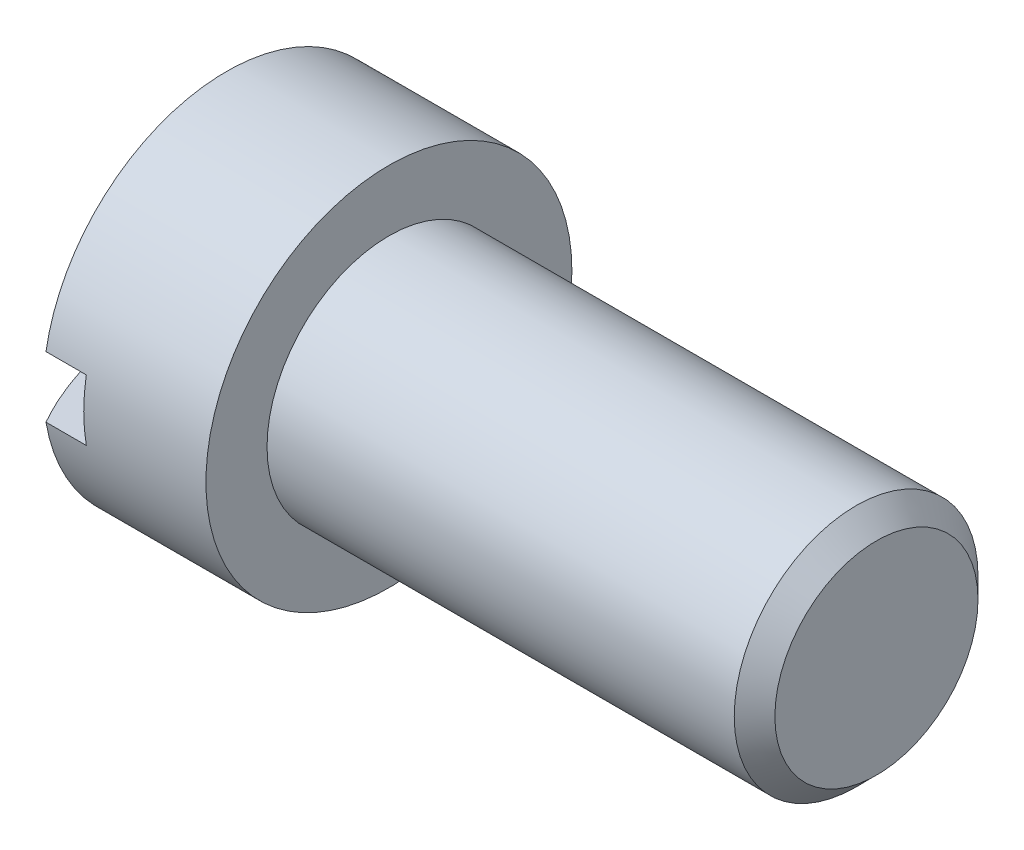
ISO-10303-21;
HEADER;
FILE_DESCRIPTION(('STEP AP214'),'2;1');
FILE_NAME('part.step','',(''),(''),'','','');
FILE_SCHEMA(('AUTOMOTIVE_DESIGN { 1 0 10303 214 1 1 1 1 }'));
ENDSEC;
DATA;
#1=APPLICATION_CONTEXT('core data for automotive mechanical design processes');
#2=APPLICATION_PROTOCOL_DEFINITION('international standard','automotive_design',2000,#1);
#3=PRODUCT_CONTEXT('',#1,'mechanical');
#4=PRODUCT('Part','Part','',(#3));
#5=PRODUCT_RELATED_PRODUCT_CATEGORY('part','',(#4));
#6=PRODUCT_DEFINITION_FORMATION('','',#4);
#7=PRODUCT_DEFINITION_CONTEXT('part definition',#1,'design');
#8=PRODUCT_DEFINITION('design','',#6,#7);
#9=PRODUCT_DEFINITION_SHAPE('','',#8);
#10=(LENGTH_UNIT() NAMED_UNIT(*) SI_UNIT(.MILLI.,.METRE.));
#11=(NAMED_UNIT(*) PLANE_ANGLE_UNIT() SI_UNIT($,.RADIAN.));
#12=(NAMED_UNIT(*) SI_UNIT($,.STERADIAN.) SOLID_ANGLE_UNIT());
#13=UNCERTAINTY_MEASURE_WITH_UNIT(LENGTH_MEASURE(1.E-05),#10,'distance_accuracy_value','');
#14=(GEOMETRIC_REPRESENTATION_CONTEXT(3) GLOBAL_UNCERTAINTY_ASSIGNED_CONTEXT((#13)) GLOBAL_UNIT_ASSIGNED_CONTEXT((#10,
#11,#12)) REPRESENTATION_CONTEXT('',''));
#15=CARTESIAN_POINT('',(0.,0.,0.));
#16=DIRECTION('',(0.,0.,1.));
#17=DIRECTION('',(1.,0.,0.));
#18=AXIS2_PLACEMENT_3D('',#15,#16,#17);
#19=CARTESIAN_POINT('',(3.9352361111111,0.,0.));
#20=DIRECTION('',(1.,0.,0.));
#21=DIRECTION('',(0.,0.,-1.));
#22=AXIS2_PLACEMENT_3D('',#19,#20,#21);
#23=DEGENERATE_TOROIDAL_SURFACE('',#22,1.1938,11.8854361111111,.T.);
#24=CARTESIAN_POINT('',(8.0396530848118,1.19379999999998,12.2902093780752));
#25=CARTESIAN_POINT('',(7.85520089790471,1.19379999999999,12.3584010545915));
#26=CARTESIAN_POINT('',(7.66908084224693,1.19379999999999,12.4219844492808));
#27=CARTESIAN_POINT('',(7.29390571835162,1.1938,12.5398043082647));
#28=CARTESIAN_POINT('',(7.10485065376635,1.1938,12.5940407841893));
#29=CARTESIAN_POINT('',(6.53397008781335,1.19379999999999,12.742511960153));
#30=CARTESIAN_POINT('',(6.14834477390266,1.19379999999999,12.8225396085569));
#31=CARTESIAN_POINT('',(5.37218014225057,1.1938,12.9436395497806));
#32=CARTESIAN_POINT('',(4.98165706606468,1.1938,12.9848173324258));
#33=CARTESIAN_POINT('',(4.19849585206472,1.19379999999999,13.0282054806809));
#34=CARTESIAN_POINT('',(3.80585819252768,1.19379999999999,13.0304243159535));
#35=CARTESIAN_POINT('',(3.08157472979572,1.19379999999999,12.9985096500023));
#36=CARTESIAN_POINT('',(2.74967657298321,1.1938,12.9698177853985));
#37=CARTESIAN_POINT('',(2.08949500332029,1.1938,12.884573070108));
#38=CARTESIAN_POINT('',(1.76121122221768,1.1938,12.8280230851222));
#39=CARTESIAN_POINT('',(1.11069899941055,1.1938,12.687490384688));
#40=CARTESIAN_POINT('',(0.788468392975654,1.1938,12.6035176815338));
#41=CARTESIAN_POINT('',(0.152215752668544,1.1938,12.4087304345693));
#42=CARTESIAN_POINT('',(-0.161806096985593,1.19379999999999,12.2979152889421));
#43=CARTESIAN_POINT('',(-0.779469646839899,1.19379999999999,12.0502061617242));
#44=CARTESIAN_POINT('',(-1.08310904714278,1.1938,11.9133064455155));
#45=CARTESIAN_POINT('',(-1.67777746479633,1.1938,11.6144204220664));
#46=CARTESIAN_POINT('',(-1.96880653551749,1.1938,11.4524342210123));
#47=CARTESIAN_POINT('',(-2.53617937974938,1.1938,11.1045357685753));
#48=CARTESIAN_POINT('',(-2.81252369010921,1.1938,10.9186243927064));
#49=CARTESIAN_POINT('',(-3.34857902130178,1.1938,10.5241962073554));
#50=CARTESIAN_POINT('',(-3.60829004116332,1.19379999999999,10.3156793965534));
#51=CARTESIAN_POINT('',(-4.10922610834812,1.1938,9.87753885853177));
#52=CARTESIAN_POINT('',(-4.35045219458225,1.1938,9.6479163191176));
#53=CARTESIAN_POINT('',(-4.81273113824556,1.1938,9.16919204281793));
#54=CARTESIAN_POINT('',(-5.03378396519399,1.1938,8.92009027650137));
#55=CARTESIAN_POINT('',(-5.45435445404505,1.1938,8.40394550576945));
#56=CARTESIAN_POINT('',(-5.65385235979072,1.1938,8.13688640015909));
#57=CARTESIAN_POINT('',(-6.02968143325761,1.1938,7.58695242241236));
#58=CARTESIAN_POINT('',(-6.2060126799245,1.1938,7.30407760417633));
#59=CARTESIAN_POINT('',(-6.534751243108,1.1938,6.7237125464066));
#60=CARTESIAN_POINT('',(-6.68709386399865,1.1938,6.42618553140621));
#61=CARTESIAN_POINT('',(-6.8964256901996,1.1938,5.97118504117174));
#62=CARTESIAN_POINT('',(-6.96300915196686,1.1938,5.81805769637626));
#63=CARTESIAN_POINT('',(-7.0897130525425,1.1938,5.50910772362124));
#64=CARTESIAN_POINT('',(-7.14983190143394,1.1938,5.35328444350857));
#65=CARTESIAN_POINT('',(-7.31991059646286,1.1938,4.88337158114465));
#66=CARTESIAN_POINT('',(-7.42011949738472,1.1938,4.5656923631588));
#67=CARTESIAN_POINT('',(-7.59392130612062,1.1938,3.92319053818356));
#68=CARTESIAN_POINT('',(-7.66751506610402,1.19379999999999,3.59836816025873));
#69=CARTESIAN_POINT('',(-7.77715638039336,1.19379999999999,3.00345995001225));
#70=CARTESIAN_POINT('',(-7.81760067828768,1.1938,2.73417771047215));
#71=CARTESIAN_POINT('',(-7.86540287004973,1.1938,2.3288435850213));
#72=CARTESIAN_POINT('',(-7.87919171396374,1.1938,2.19351884250897));
#73=CARTESIAN_POINT('',(-7.90268627658377,1.1938,1.92251599445672));
#74=CARTESIAN_POINT('',(-7.91239208671931,1.1938,1.78683789689778));
#75=CARTESIAN_POINT('',(-7.92808780467383,1.1938,1.51462718231538));
#76=CARTESIAN_POINT('',(-7.93405988270254,1.1938,1.3780935630435));
#77=CARTESIAN_POINT('',(-7.94282314065937,1.1938,1.10492971644373));
#78=CARTESIAN_POINT('',(-7.94561430833977,1.1938,0.968299488745883));
#79=CARTESIAN_POINT('',(-7.9490493277279,1.1938,0.694905927256367));
#80=CARTESIAN_POINT('',(-7.94969140170108,1.1938,0.55814257683113));
#81=CARTESIAN_POINT('',(-7.95027018935255,1.1938,0.284612315647635));
#82=CARTESIAN_POINT('',(-7.95020688031642,1.1938,0.147845404916545));
#83=CARTESIAN_POINT('',(-7.95019479748847,1.1938,-0.0923333390236393));
#84=CARTESIAN_POINT('',(-7.95022185595499,1.1938,-0.195745122651376));
#85=CARTESIAN_POINT('',(-7.95006350410102,1.1938,-0.402569645296127));
#86=CARTESIAN_POINT('',(-7.9498780920252,1.1938,-0.505982384313976));
#87=CARTESIAN_POINT('',(-7.94871504951327,1.1938,-0.71279992218481));
#88=CARTESIAN_POINT('',(-7.94773745819823,1.1938,-0.816204721177718));
#89=CARTESIAN_POINT('',(-7.94441179355912,1.1938,-1.02299282263545));
#90=CARTESIAN_POINT('',(-7.942063741084,1.1938,-1.12637612540337));
#91=CARTESIAN_POINT('',(-7.93557112871514,1.1938,-1.33297082791105));
#92=CARTESIAN_POINT('',(-7.93142862307833,1.1938,-1.43618228915013));
#93=CARTESIAN_POINT('',(-7.92106386259783,1.1938,-1.64250061592368));
#94=CARTESIAN_POINT('',(-7.91484159403816,1.1938,-1.74560748076383));
#95=CARTESIAN_POINT('',(-7.89276119577191,1.1938,-2.05468967247153));
#96=CARTESIAN_POINT('',(-7.87348920925232,1.1938,-2.26043631983072));
#97=CARTESIAN_POINT('',(-7.82522609041713,1.1938,-2.66935842738015));
#98=CARTESIAN_POINT('',(-7.79630250472506,1.1938,-2.8725418444053));
#99=CARTESIAN_POINT('',(-7.72842320371711,1.1938,-3.2772406567429));
#100=CARTESIAN_POINT('',(-7.68946701602244,1.1938,-3.47875597305262));
#101=CARTESIAN_POINT('',(-7.60138561272814,1.1938,-3.87977489679563));
#102=CARTESIAN_POINT('',(-7.5522499726856,1.1938,-4.07927622038412));
#103=CARTESIAN_POINT('',(-7.4438683149751,1.1938,-4.47549184525321));
#104=CARTESIAN_POINT('',(-7.38462273410486,1.19379999999999,-4.6722062665438));
#105=CARTESIAN_POINT('',(-7.21593855343618,1.19379999999999,-5.18425057885822));
#106=CARTESIAN_POINT('',(-7.09826506377468,1.1938,-5.49691122200817));
#107=CARTESIAN_POINT('',(-6.83719473341262,1.1938,-6.11107141571331));
#108=CARTESIAN_POINT('',(-6.69381156353057,1.1938,-6.41257679565961));
#109=CARTESIAN_POINT('',(-6.38145268406855,1.1938,-7.0039141983822));
#110=CARTESIAN_POINT('',(-6.21235611144503,1.1938,-7.29368244567776));
#111=CARTESIAN_POINT('',(-5.85025900366509,1.1938,-7.85787327849428));
#112=CARTESIAN_POINT('',(-5.65725859799705,1.1938,-8.1322959471314));
#113=CARTESIAN_POINT('',(-5.2489529960244,1.1938,-8.66350295565282));
#114=CARTESIAN_POINT('',(-5.03367419119344,1.1938,-8.92030757963071));
#115=CARTESIAN_POINT('',(-4.58216533590221,1.1938,-9.41476406717873));
#116=CARTESIAN_POINT('',(-4.34593630295095,1.1938,-9.65241685984462));
#117=CARTESIAN_POINT('',(-3.85462451226875,1.1938,-10.1064807137906));
#118=CARTESIAN_POINT('',(-3.5995745815332,1.1938,-10.3229272958217));
#119=CARTESIAN_POINT('',(-3.07208449565301,1.1938,-10.7334831579415));
#120=CARTESIAN_POINT('',(-2.79964418445794,1.1938,-10.9275922375436));
#121=CARTESIAN_POINT('',(-2.24029201390866,1.1938,-11.2914450588816));
#122=CARTESIAN_POINT('',(-1.95343336673973,1.1938,-11.461270610668));
#123=CARTESIAN_POINT('',(-1.3664224215242,1.1938,-11.7761371359061));
#124=CARTESIAN_POINT('',(-1.06627015833453,1.1938,-11.9211781743401));
#125=CARTESIAN_POINT('',(-0.454642997526441,1.1938,-12.1855112038512));
#126=CARTESIAN_POINT('',(-0.143162123600684,1.1938,-12.304789366821));
#127=CARTESIAN_POINT('',(0.488748283195235,1.19379999999999,-12.5166446698401));
#128=CARTESIAN_POINT('',(0.809177729387157,1.19379999999998,-12.6092220684216));
#129=CARTESIAN_POINT('',(1.45638749859692,1.19379999999998,-12.7669388104687));
#130=CARTESIAN_POINT('',(1.78316131882352,1.19379999999999,-12.8321048417806));
#131=CARTESIAN_POINT('',(2.44104395532263,1.1938,-12.9346647923982));
#132=CARTESIAN_POINT('',(2.7721528204911,1.1938,-12.9720583981773));
#133=CARTESIAN_POINT('',(3.43621057573487,1.1938,-13.0187978253269));
#134=CARTESIAN_POINT('',(3.76915871039798,1.1938,-13.0281544117818));
#135=CARTESIAN_POINT('',(4.43462458210509,1.1938,-13.0187797585805));
#136=CARTESIAN_POINT('',(4.7671423827774,1.19379999999999,-13.0000533009278));
#137=CARTESIAN_POINT('',(5.34937175767284,1.19379999999999,-12.9425676277699));
#138=CARTESIAN_POINT('',(5.5996865053063,1.1938,-12.9097389947097));
#139=CARTESIAN_POINT('',(6.09769965088768,1.1938,-12.82815338147));
#140=CARTESIAN_POINT('',(6.34539824969093,1.19379999999999,-12.7793976334105));
#141=CARTESIAN_POINT('',(6.8369351441714,1.19379999999999,-12.666207275864));
#142=CARTESIAN_POINT('',(7.08077688798847,1.1938,-12.6017876257712));
#143=CARTESIAN_POINT('',(7.56389677356005,1.19379999999999,-12.45750938379));
#144=CARTESIAN_POINT('',(7.80317408801367,1.19379999999999,-12.3776480217669));
#145=CARTESIAN_POINT('',(8.0396530848118,1.19379999999998,-12.2902093780752));
#146=B_SPLINE_CURVE_WITH_KNOTS('',3,(#24,#25,#26,#27,#28,#29,#30,#31,#32,#33,#34,#35,#36,#37,
#38,#39,#40,#41,#42,#43,#44,#45,#46,#47,#48,#49,#50,#51,#52,#53,#54,#55,#56,#57,#58,#59,#60,#61,
#62,#63,#64,#65,#66,#67,#68,#69,#70,#71,#72,#73,#74,#75,#76,#77,#78,#79,#80,#81,#82,#83,#84,#85,
#86,#87,#88,#89,#90,#91,#92,#93,#94,#95,#96,#97,#98,#99,#100,#101,#102,#103,#104,#105,#106,#107,
#108,#109,#110,#111,#112,#113,#114,#115,#116,#117,#118,#119,#120,#121,#122,#123,#124,#125,#126,
#127,#128,#129,#130,#131,#132,#133,#134,#135,#136,#137,#138,#139,#140,#141,#142,#143,#144,#145),
.UNSPECIFIED.,.F.,.F.,(4,2,2,2,2,2,2,2,2,2,2,2,2,2,2,2,2,2,2,2,2,2,2,2,2,2,2,2,2,2,2,2,2,2,2,2,
2,2,2,2,2,2,2,2,2,2,2,2,2,2,2,2,2,2,2,2,2,2,2,2,4),(0.,0.589833265527094,1.17966579713864,
2.35906200898913,3.53524648688518,4.71117525948138,5.70943908074087,6.70760023432858,
7.70539735651064,8.70321685171956,9.70125596831913,10.6992908605207,11.6972892411783,
12.6952876801073,13.6932299872117,14.6911738021299,15.6900246588208,16.6888721116108,
17.6903688777917,18.191173572727,18.6921011559884,19.6901826937812,20.6882322719526,
21.5045389923977,21.9125618326918,22.320575535829,22.7305230468053,23.1404721362312,
23.5507602526541,23.9610615810272,24.271296921539,24.5815348251079,24.8917574087945,
25.2019752731603,25.5118389404793,25.8217046513788,26.4414069165307,27.0568601128039,
27.672342292606,28.28845791104,28.9045469170725,29.9055092019422,30.9059408068782,
31.9112291331992,32.9165120140568,33.9206173590723,34.9246739634583,35.9270189235055,
36.9293728792357,37.9282661010844,38.9271567039089,39.9265821316902,40.9259978821279,
41.9244383314309,42.9228900520875,43.9209583583992,44.9188567321227,45.6757454113741,
46.4325755516525,47.1886857208242,47.9449316569132),.UNSPECIFIED.);
#147=CARTESIAN_POINT('',(-6.35,1.19379999999999,7.04973556738123));
#148=VERTEX_POINT('',#147);
#149=CARTESIAN_POINT('',(-6.35,1.1938,-7.04973556738123));
#150=VERTEX_POINT('',#149);
#151=EDGE_CURVE('E73',#148,#150,#146,.T.);
#152=ORIENTED_EDGE('',*,*,#151,.F.);
#153=CARTESIAN_POINT('',(-6.35,0.,0.));
#154=DIRECTION('',(1.,0.,0.));
#155=DIRECTION('',(0.,0.,-1.));
#156=AXIS2_PLACEMENT_3D('',#153,#154,#155);
#157=CIRCLE('',#156,7.1501);
#158=EDGE_CURVE('E147',#150,#148,#157,.T.);
#159=ORIENTED_EDGE('',*,*,#158,.F.);
#160=EDGE_LOOP('',(#152,#159));
#161=FACE_BOUND('',#160,.T.);
#162=ADVANCED_FACE('F54',(#161),#23,.T.);
#163=CARTESIAN_POINT('',(19.05,0.,0.));
#164=DIRECTION('',(1.,0.,0.));
#165=DIRECTION('',(0.,0.,-1.));
#166=AXIS2_PLACEMENT_3D('',#163,#164,#165);
#167=PLANE('',#166);
#168=CARTESIAN_POINT('',(19.05,0.,0.));
#169=DIRECTION('',(1.,0.,0.));
#170=DIRECTION('',(0.,0.,-1.));
#171=AXIS2_PLACEMENT_3D('',#168,#169,#170);
#172=CIRCLE('',#171,3.96875);
#173=CARTESIAN_POINT('',(19.05,0.,3.96875));
#174=VERTEX_POINT('',#173);
#175=EDGE_CURVE('E62',#174,#174,#172,.T.);
#176=ORIENTED_EDGE('',*,*,#175,.T.);
#177=EDGE_LOOP('',(#176));
#178=FACE_BOUND('',#177,.T.);
#179=ADVANCED_FACE('F158',(#178),#167,.T.);
#180=CARTESIAN_POINT('',(25.6382761904762,0.,0.));
#181=DIRECTION('',(1.,0.,0.));
#182=DIRECTION('',(0.,0.,-1.));
#183=AXIS2_PLACEMENT_3D('',#180,#181,#182);
#184=CYLINDRICAL_SURFACE('',#183,4.7625);
#185=CARTESIAN_POINT('',(18.25625,0.,0.));
#186=DIRECTION('',(1.,0.,0.));
#187=DIRECTION('',(0.,0.,-1.));
#188=AXIS2_PLACEMENT_3D('',#185,#186,#187);
#189=CIRCLE('',#188,4.7625);
#190=CARTESIAN_POINT('',(18.25625,0.,4.7625));
#191=VERTEX_POINT('',#190);
#192=EDGE_CURVE('E13',#191,#191,#189,.F.);
#193=ORIENTED_EDGE('',*,*,#192,.T.);
#194=EDGE_LOOP('',(#193));
#195=FACE_BOUND('',#194,.T.);
#196=CARTESIAN_POINT('',(0.,0.,0.));
#197=DIRECTION('',(1.,0.,0.));
#198=DIRECTION('',(0.,0.,-1.));
#199=AXIS2_PLACEMENT_3D('',#196,#197,#198);
#200=CIRCLE('',#199,4.7625);
#201=CARTESIAN_POINT('',(0.,0.,-4.7625));
#202=VERTEX_POINT('',#201);
#203=EDGE_CURVE('E153',#202,#202,#200,.T.);
#204=ORIENTED_EDGE('',*,*,#203,.T.);
#205=EDGE_LOOP('',(#204));
#206=FACE_BOUND('',#205,.T.);
#207=ADVANCED_FACE('F171',(#195,#206),#184,.T.);
#208=CARTESIAN_POINT('',(0.,4.76249999999999,0.));
#209=DIRECTION('',(1.,0.,0.));
#210=DIRECTION('',(0.,0.,-1.));
#211=AXIS2_PLACEMENT_3D('',#208,#209,#210);
#212=PLANE('',#211);
#213=CARTESIAN_POINT('',(0.,0.,0.));
#214=DIRECTION('',(1.,0.,0.));
#215=DIRECTION('',(0.,0.,-1.));
#216=AXIS2_PLACEMENT_3D('',#213,#214,#215);
#217=CIRCLE('',#216,7.1501);
#218=CARTESIAN_POINT('',(0.,0.,-7.1501));
#219=VERTEX_POINT('',#218);
#220=EDGE_CURVE('E150',#219,#219,#217,.T.);
#221=ORIENTED_EDGE('',*,*,#220,.T.);
#222=EDGE_LOOP('',(#221));
#223=FACE_BOUND('',#222,.T.);
#224=ORIENTED_EDGE('',*,*,#203,.F.);
#225=EDGE_LOOP('',(#224));
#226=FACE_BOUND('',#225,.T.);
#227=ADVANCED_FACE('F178',(#223,#226),#212,.T.);
#228=CARTESIAN_POINT('',(25.6382761904762,0.,0.));
#229=DIRECTION('',(1.,0.,0.));
#230=DIRECTION('',(0.,0.,-1.));
#231=AXIS2_PLACEMENT_3D('',#228,#229,#230);
#232=CYLINDRICAL_SURFACE('',#231,7.1501);
#233=CARTESIAN_POINT('',(-4.7752,0.,0.));
#234=DIRECTION('',(1.,0.,0.));
#235=DIRECTION('',(0.,0.,-1.));
#236=AXIS2_PLACEMENT_3D('',#233,#234,#235);
#237=CIRCLE('',#236,7.1501);
#238=CARTESIAN_POINT('',(-4.7752,1.1938,-7.04973556738123));
#239=VERTEX_POINT('',#238);
#240=CARTESIAN_POINT('',(-4.7752,-1.19380000000001,-7.04973556738123));
#241=VERTEX_POINT('',#240);
#242=EDGE_CURVE('E107',#239,#241,#237,.F.);
#243=ORIENTED_EDGE('',*,*,#242,.F.);
#244=DIRECTION('',(1.,0.,0.));
#245=VECTOR('',#244,1.);
#246=CARTESIAN_POINT('',(25.6382761904762,1.19379999999999,-7.04973556738123));
#247=LINE('',#246,#245);
#248=EDGE_CURVE('E122',#150,#239,#247,.T.);
#249=ORIENTED_EDGE('',*,*,#248,.F.);
#250=ORIENTED_EDGE('',*,*,#158,.T.);
#251=DIRECTION('',(1.,0.,0.));
#252=VECTOR('',#251,1.);
#253=CARTESIAN_POINT('',(25.6382761904762,1.19379999999999,7.04973556738123));
#254=LINE('',#253,#252);
#255=CARTESIAN_POINT('',(-4.7752,1.19379999999999,7.04973556738123));
#256=VERTEX_POINT('',#255);
#257=EDGE_CURVE('E69',#256,#148,#254,.F.);
#258=ORIENTED_EDGE('',*,*,#257,.F.);
#259=CARTESIAN_POINT('',(-4.7752,-1.1938,7.04973556738124));
#260=VERTEX_POINT('',#259);
#261=EDGE_CURVE('E110',#260,#256,#237,.F.);
#262=ORIENTED_EDGE('',*,*,#261,.F.);
#263=DIRECTION('',(1.,0.,0.));
#264=VECTOR('',#263,1.);
#265=CARTESIAN_POINT('',(25.6382761904762,-1.19379999999999,7.04973556738124));
#266=LINE('',#265,#264);
#267=CARTESIAN_POINT('',(-6.35,-1.1938,7.04973556738124));
#268=VERTEX_POINT('',#267);
#269=EDGE_CURVE('E101',#268,#260,#266,.T.);
#270=ORIENTED_EDGE('',*,*,#269,.F.);
#271=CARTESIAN_POINT('',(-6.35,-1.1938,-7.04973556738123));
#272=VERTEX_POINT('',#271);
#273=EDGE_CURVE('E116',#268,#272,#157,.T.);
#274=ORIENTED_EDGE('',*,*,#273,.T.);
#275=DIRECTION('',(1.,0.,0.));
#276=VECTOR('',#275,1.);
#277=CARTESIAN_POINT('',(25.6382761904762,-1.1938,-7.04973556738122));
#278=LINE('',#277,#276);
#279=EDGE_CURVE('E98',#241,#272,#278,.F.);
#280=ORIENTED_EDGE('',*,*,#279,.F.);
#281=EDGE_LOOP('',(#243,#249,#250,#258,#262,#270,#274,#280));
#282=FACE_BOUND('',#281,.T.);
#283=ORIENTED_EDGE('',*,*,#220,.F.);
#284=EDGE_LOOP('',(#283));
#285=FACE_BOUND('',#284,.T.);
#286=ADVANCED_FACE('F113',(#282,#285),#232,.T.);
#287=CARTESIAN_POINT('',(8.0396530848118,-1.1938,-12.2902093780752));
#288=CARTESIAN_POINT('',(7.85520089790471,-1.1938,-12.3584010545915));
#289=CARTESIAN_POINT('',(7.66908084224693,-1.1938,-12.4219844492808));
#290=CARTESIAN_POINT('',(7.29390571835162,-1.19379999999999,-12.5398043082647));
#291=CARTESIAN_POINT('',(7.10485065376635,-1.19379999999999,-12.5940407841893));
#292=CARTESIAN_POINT('',(6.53397008781336,-1.1938,-12.742511960153));
#293=CARTESIAN_POINT('',(6.14834477390266,-1.1938,-12.8225396085569));
#294=CARTESIAN_POINT('',(5.37218014225058,-1.19379999999999,-12.9436395497806));
#295=CARTESIAN_POINT('',(4.98165706606468,-1.19379999999999,-12.9848173324258));
#296=CARTESIAN_POINT('',(4.19849585206472,-1.1938,-13.0282054806809));
#297=CARTESIAN_POINT('',(3.80585819252768,-1.19380000000001,-13.0304243159534));
#298=CARTESIAN_POINT('',(3.08157472979572,-1.19380000000001,-12.9985096500023));
#299=CARTESIAN_POINT('',(2.74967657298321,-1.1938,-12.9698177853985));
#300=CARTESIAN_POINT('',(2.08949500332029,-1.19379999999999,-12.884573070108));
#301=CARTESIAN_POINT('',(1.76121122221768,-1.1938,-12.8280230851222));
#302=CARTESIAN_POINT('',(1.11069899941055,-1.1938,-12.687490384688));
#303=CARTESIAN_POINT('',(0.788468392975653,-1.19379999999999,-12.6035176815338));
#304=CARTESIAN_POINT('',(0.152215752668544,-1.1938,-12.4087304345693));
#305=CARTESIAN_POINT('',(-0.161806096985593,-1.19380000000001,-12.2979152889421));
#306=CARTESIAN_POINT('',(-0.7794696468399,-1.19380000000001,-12.0502061617242));
#307=CARTESIAN_POINT('',(-1.08310904714278,-1.1938,-11.9133064455155));
#308=CARTESIAN_POINT('',(-1.67777746479633,-1.1938,-11.6144204220664));
#309=CARTESIAN_POINT('',(-1.96880653551749,-1.1938,-11.4524342210123));
#310=CARTESIAN_POINT('',(-2.53617937974938,-1.1938,-11.1045357685753));
#311=CARTESIAN_POINT('',(-2.81252369010922,-1.1938,-10.9186243927064));
#312=CARTESIAN_POINT('',(-3.34857902130178,-1.1938,-10.5241962073554));
#313=CARTESIAN_POINT('',(-3.60829004116332,-1.1938,-10.3156793965534));
#314=CARTESIAN_POINT('',(-4.10922610834812,-1.1938,-9.87753885853175));
#315=CARTESIAN_POINT('',(-4.35045219458226,-1.1938,-9.64791631911759));
#316=CARTESIAN_POINT('',(-4.81273113824556,-1.1938,-9.16919204281792));
#317=CARTESIAN_POINT('',(-5.03378396519399,-1.1938,-8.92009027650137));
#318=CARTESIAN_POINT('',(-5.45435445404505,-1.1938,-8.40394550576944));
#319=CARTESIAN_POINT('',(-5.65385235979073,-1.1938,-8.13688640015908));
#320=CARTESIAN_POINT('',(-6.02968143325761,-1.1938,-7.58695242241235));
#321=CARTESIAN_POINT('',(-6.2060126799245,-1.1938,-7.30407760417632));
#322=CARTESIAN_POINT('',(-6.534751243108,-1.1938,-6.72371254640659));
#323=CARTESIAN_POINT('',(-6.68709386399866,-1.1938,-6.4261855314062));
#324=CARTESIAN_POINT('',(-6.8964256901996,-1.1938,-5.97118504117173));
#325=CARTESIAN_POINT('',(-6.96300915196686,-1.1938,-5.81805769637625));
#326=CARTESIAN_POINT('',(-7.0897130525425,-1.1938,-5.50910772362123));
#327=CARTESIAN_POINT('',(-7.14983190143394,-1.1938,-5.35328444350856));
#328=CARTESIAN_POINT('',(-7.31991059646287,-1.1938,-4.88337158114464));
#329=CARTESIAN_POINT('',(-7.42011949738472,-1.1938,-4.56569236315879));
#330=CARTESIAN_POINT('',(-7.59392130612062,-1.19380000000001,-3.92319053818356));
#331=CARTESIAN_POINT('',(-7.66751506610402,-1.19380000000002,-3.59836816025873));
#332=CARTESIAN_POINT('',(-7.77715638039336,-1.19380000000001,-3.00345995001225));
#333=CARTESIAN_POINT('',(-7.81760067828767,-1.1938,-2.73417771047214));
#334=CARTESIAN_POINT('',(-7.86540287004973,-1.1938,-2.3288435850213));
#335=CARTESIAN_POINT('',(-7.87919171396374,-1.1938,-2.19351884250897));
#336=CARTESIAN_POINT('',(-7.90268627658377,-1.1938,-1.92251599445672));
#337=CARTESIAN_POINT('',(-7.91239208671931,-1.1938,-1.78683789689778));
#338=CARTESIAN_POINT('',(-7.92808780467383,-1.1938,-1.51462718231538));
#339=CARTESIAN_POINT('',(-7.93405988270254,-1.1938,-1.3780935630435));
#340=CARTESIAN_POINT('',(-7.94282314065937,-1.1938,-1.10492971644373));
#341=CARTESIAN_POINT('',(-7.94561430833977,-1.1938,-0.96829948874588));
#342=CARTESIAN_POINT('',(-7.9490493277279,-1.1938,-0.694905927256365));
#343=CARTESIAN_POINT('',(-7.94969140170108,-1.1938,-0.558142576831128));
#344=CARTESIAN_POINT('',(-7.95027018935255,-1.1938,-0.284612315647633));
#345=CARTESIAN_POINT('',(-7.95020688031642,-1.1938,-0.147845404916542));
#346=CARTESIAN_POINT('',(-7.95019479748847,-1.1938,0.0923333390236416));
#347=CARTESIAN_POINT('',(-7.95022185595499,-1.1938,0.195745122651378));
#348=CARTESIAN_POINT('',(-7.95006350410102,-1.1938,0.402569645296129));
#349=CARTESIAN_POINT('',(-7.9498780920252,-1.1938,0.505982384313979));
#350=CARTESIAN_POINT('',(-7.94871504951327,-1.1938,0.712799922184815));
#351=CARTESIAN_POINT('',(-7.94773745819823,-1.1938,0.816204721177724));
#352=CARTESIAN_POINT('',(-7.94441179355912,-1.1938,1.02299282263546));
#353=CARTESIAN_POINT('',(-7.942063741084,-1.1938,1.12637612540338));
#354=CARTESIAN_POINT('',(-7.93557112871514,-1.1938,1.33297082791105));
#355=CARTESIAN_POINT('',(-7.93142862307833,-1.1938,1.43618228915014));
#356=CARTESIAN_POINT('',(-7.92106386259783,-1.1938,1.64250061592368));
#357=CARTESIAN_POINT('',(-7.91484159403816,-1.1938,1.74560748076383));
#358=CARTESIAN_POINT('',(-7.89276119577191,-1.1938,2.05468967247154));
#359=CARTESIAN_POINT('',(-7.87348920925232,-1.1938,2.26043631983073));
#360=CARTESIAN_POINT('',(-7.82522609041713,-1.1938,2.66935842738015));
#361=CARTESIAN_POINT('',(-7.79630250472506,-1.1938,2.8725418444053));
#362=CARTESIAN_POINT('',(-7.72842320371711,-1.1938,3.2772406567429));
#363=CARTESIAN_POINT('',(-7.68946701602244,-1.1938,3.47875597305263));
#364=CARTESIAN_POINT('',(-7.60138561272814,-1.1938,3.87977489679564));
#365=CARTESIAN_POINT('',(-7.5522499726856,-1.1938,4.07927622038413));
#366=CARTESIAN_POINT('',(-7.44386831497509,-1.1938,4.47549184525321));
#367=CARTESIAN_POINT('',(-7.38462273410486,-1.1938,4.6722062665438));
#368=CARTESIAN_POINT('',(-7.21593855343618,-1.1938,5.18425057885822));
#369=CARTESIAN_POINT('',(-7.09826506377468,-1.1938,5.49691122200818));
#370=CARTESIAN_POINT('',(-6.83719473341262,-1.1938,6.11107141571331));
#371=CARTESIAN_POINT('',(-6.69381156353057,-1.1938,6.41257679565962));
#372=CARTESIAN_POINT('',(-6.38145268406854,-1.1938,7.0039141983822));
#373=CARTESIAN_POINT('',(-6.21235611144502,-1.1938,7.29368244567776));
#374=CARTESIAN_POINT('',(-5.85025900366509,-1.1938,7.85787327849429));
#375=CARTESIAN_POINT('',(-5.65725859799705,-1.19380000000002,8.13229594713141));
#376=CARTESIAN_POINT('',(-5.2489529960244,-1.19380000000002,8.66350295565283));
#377=CARTESIAN_POINT('',(-5.03367419119343,-1.1938,8.92030757963072));
#378=CARTESIAN_POINT('',(-4.5821653359022,-1.1938,9.41476406717874));
#379=CARTESIAN_POINT('',(-4.34593630295095,-1.1938,9.65241685984463));
#380=CARTESIAN_POINT('',(-3.85462451226874,-1.1938,10.1064807137906));
#381=CARTESIAN_POINT('',(-3.59957458153319,-1.1938,10.3229272958217));
#382=CARTESIAN_POINT('',(-3.072084495653,-1.1938,10.7334831579416));
#383=CARTESIAN_POINT('',(-2.79964418445794,-1.1938,10.9275922375437));
#384=CARTESIAN_POINT('',(-2.24029201390866,-1.1938,11.2914450588816));
#385=CARTESIAN_POINT('',(-1.95343336673973,-1.1938,11.461270610668));
#386=CARTESIAN_POINT('',(-1.36642242152419,-1.1938,11.7761371359061));
#387=CARTESIAN_POINT('',(-1.06627015833452,-1.1938,11.9211781743401));
#388=CARTESIAN_POINT('',(-0.454642997526433,-1.1938,12.1855112038512));
#389=CARTESIAN_POINT('',(-0.143162123600675,-1.1938,12.304789366821));
#390=CARTESIAN_POINT('',(0.48874828319524,-1.1938,12.5166446698401));
#391=CARTESIAN_POINT('',(0.80917772938716,-1.1938,12.6092220684216));
#392=CARTESIAN_POINT('',(1.45638749859692,-1.1938,12.7669388104687));
#393=CARTESIAN_POINT('',(1.78316131882352,-1.1938,12.8321048417806));
#394=CARTESIAN_POINT('',(2.44104395532263,-1.1938,12.9346647923982));
#395=CARTESIAN_POINT('',(2.7721528204911,-1.1938,12.9720583981773));
#396=CARTESIAN_POINT('',(3.43621057573487,-1.1938,13.0187978253269));
#397=CARTESIAN_POINT('',(3.76915871039798,-1.19379999999999,13.0281544117818));
#398=CARTESIAN_POINT('',(4.43462458210509,-1.1938,13.0187797585805));
#399=CARTESIAN_POINT('',(4.7671423827774,-1.1938,13.0000533009278));
#400=CARTESIAN_POINT('',(5.34937175767284,-1.1938,12.9425676277699));
#401=CARTESIAN_POINT('',(5.5996865053063,-1.1938,12.9097389947097));
#402=CARTESIAN_POINT('',(6.09769965088768,-1.19379999999999,12.82815338147));
#403=CARTESIAN_POINT('',(6.34539824969093,-1.19379999999999,12.7793976334105));
#404=CARTESIAN_POINT('',(6.83693514417139,-1.19379999999999,12.666207275864));
#405=CARTESIAN_POINT('',(7.08077688798846,-1.19379999999999,12.6017876257712));
#406=CARTESIAN_POINT('',(7.56389677356005,-1.19379999999999,12.45750938379));
#407=CARTESIAN_POINT('',(7.80317408801367,-1.1938,12.3776480217669));
#408=CARTESIAN_POINT('',(8.0396530848118,-1.1938,12.2902093780752));
#409=B_SPLINE_CURVE_WITH_KNOTS('',3,(#287,#288,#289,#290,#291,#292,#293,#294,#295,#296,#297,
#298,#299,#300,#301,#302,#303,#304,#305,#306,#307,#308,#309,#310,#311,#312,#313,#314,#315,#316,
#317,#318,#319,#320,#321,#322,#323,#324,#325,#326,#327,#328,#329,#330,#331,#332,#333,#334,#335,
#336,#337,#338,#339,#340,#341,#342,#343,#344,#345,#346,#347,#348,#349,#350,#351,#352,#353,#354,
#355,#356,#357,#358,#359,#360,#361,#362,#363,#364,#365,#366,#367,#368,#369,#370,#371,#372,#373,
#374,#375,#376,#377,#378,#379,#380,#381,#382,#383,#384,#385,#386,#387,#388,#389,#390,#391,#392,
#393,#394,#395,#396,#397,#398,#399,#400,#401,#402,#403,#404,#405,#406,#407,#408),.UNSPECIFIED.,
.F.,.F.,(4,2,2,2,2,2,2,2,2,2,2,2,2,2,2,2,2,2,2,2,2,2,2,2,2,2,2,2,2,2,2,2,2,2,2,2,2,2,2,2,2,2,2,
2,2,2,2,2,2,2,2,2,2,2,2,2,2,2,2,2,4),(0.,0.589833265527094,1.17966579713865,2.35906200898913,
3.53524648688518,4.71117525948138,5.70943908074088,6.70760023432859,7.70539735651064,
8.70321685171957,9.70125596831913,10.6992908605207,11.6972892411783,12.6952876801073,
13.6932299872117,14.6911738021299,15.6900246588208,16.6888721116108,17.6903688777917,
18.191173572727,18.6921011559884,19.6901826937812,20.6882322719526,21.5045389923977,
21.9125618326919,22.320575535829,22.7305230468053,23.1404721362312,23.5507602526541,
23.9610615810272,24.271296921539,24.581534825108,24.8917574087945,25.2019752731603,
25.5118389404793,25.8217046513788,26.4414069165307,27.0568601128039,27.672342292606,
28.28845791104,28.9045469170725,29.9055092019422,30.9059408068782,31.9112291331992,
32.9165120140568,33.9206173590723,34.9246739634583,35.9270189235055,36.9293728792357,
37.9282661010845,38.9271567039089,39.9265821316903,40.9259978821279,41.9244383314309,
42.9228900520875,43.9209583583992,44.9188567321228,45.6757454113741,46.4325755516525,
47.1886857208242,47.9449316569132),.UNSPECIFIED.);
#410=EDGE_CURVE('E117',#272,#268,#409,.T.);
#411=ORIENTED_EDGE('',*,*,#410,.F.);
#412=ORIENTED_EDGE('',*,*,#273,.F.);
#413=EDGE_LOOP('',(#411,#412));
#414=FACE_BOUND('',#413,.T.);
#415=ADVANCED_FACE('F131',(#414),#23,.T.);
#416=CARTESIAN_POINT('',(-7.9502,1.1938,-7.1501));
#417=DIRECTION('',(0.,1.,0.));
#418=DIRECTION('',(-1.,0.,0.));
#419=AXIS2_PLACEMENT_3D('',#416,#417,#418);
#420=PLANE('',#419);
#421=ORIENTED_EDGE('',*,*,#248,.T.);
#422=DIRECTION('',(0.,0.,1.));
#423=VECTOR('',#422,1.);
#424=CARTESIAN_POINT('',(-4.7752,1.1938,-7.1501));
#425=LINE('',#424,#423);
#426=EDGE_CURVE('E104',#239,#256,#425,.T.);
#427=ORIENTED_EDGE('',*,*,#426,.T.);
#428=ORIENTED_EDGE('',*,*,#257,.T.);
#429=ORIENTED_EDGE('',*,*,#151,.T.);
#430=EDGE_LOOP('',(#421,#427,#428,#429));
#431=FACE_BOUND('',#430,.T.);
#432=ADVANCED_FACE('F134',(#431),#420,.F.);
#433=CARTESIAN_POINT('',(-7.9502,-1.1938,-7.15009999999999));
#434=DIRECTION('',(0.,-1.,0.));
#435=DIRECTION('',(1.,0.,0.));
#436=AXIS2_PLACEMENT_3D('',#433,#434,#435);
#437=PLANE('',#436);
#438=ORIENTED_EDGE('',*,*,#269,.T.);
#439=DIRECTION('',(0.,0.,1.));
#440=VECTOR('',#439,1.);
#441=CARTESIAN_POINT('',(-4.7752,-1.1938,-7.15009999999999));
#442=LINE('',#441,#440);
#443=EDGE_CURVE('E94',#241,#260,#442,.T.);
#444=ORIENTED_EDGE('',*,*,#443,.F.);
#445=ORIENTED_EDGE('',*,*,#279,.T.);
#446=ORIENTED_EDGE('',*,*,#410,.T.);
#447=EDGE_LOOP('',(#438,#444,#445,#446));
#448=FACE_BOUND('',#447,.T.);
#449=ADVANCED_FACE('F96',(#448),#437,.F.);
#450=CARTESIAN_POINT('',(-4.7752,1.1938,0.));
#451=DIRECTION('',(-1.,0.,0.));
#452=DIRECTION('',(0.,0.,1.));
#453=AXIS2_PLACEMENT_3D('',#450,#451,#452);
#454=PLANE('',#453);
#455=ORIENTED_EDGE('',*,*,#242,.T.);
#456=ORIENTED_EDGE('',*,*,#443,.T.);
#457=ORIENTED_EDGE('',*,*,#261,.T.);
#458=ORIENTED_EDGE('',*,*,#426,.F.);
#459=EDGE_LOOP('',(#455,#456,#457,#458));
#460=FACE_BOUND('',#459,.T.);
#461=ADVANCED_FACE('F108',(#460),#454,.T.);
#462=CARTESIAN_POINT('',(19.05,0.,0.));
#463=DIRECTION('',(-1.,0.,0.));
#464=DIRECTION('',(0.,0.,1.));
#465=AXIS2_PLACEMENT_3D('',#462,#463,#464);
#466=CONICAL_SURFACE('',#465,3.96875,0.785398163397447);
#467=CARTESIAN_POINT('',(18.25625,0.,4.7625));
#468=CARTESIAN_POINT('',(18.2645182291667,0.,4.75423177083333));
#469=CARTESIAN_POINT('',(18.2727864583333,0.,4.74596354166667));
#470=CARTESIAN_POINT('',(18.2893229166667,0.,4.72942708333333));
#471=CARTESIAN_POINT('',(18.2975911458333,0.,4.72115885416667));
#472=CARTESIAN_POINT('',(18.3141276041667,0.,4.70462239583333));
#473=CARTESIAN_POINT('',(18.3223958333333,0.,4.69635416666667));
#474=CARTESIAN_POINT('',(18.3389322916667,0.,4.67981770833333));
#475=CARTESIAN_POINT('',(18.3472005208333,0.,4.67154947916667));
#476=CARTESIAN_POINT('',(18.3637369791667,0.,4.65501302083333));
#477=CARTESIAN_POINT('',(18.3720052083333,0.,4.64674479166666));
#478=CARTESIAN_POINT('',(18.3885416666667,0.,4.63020833333333));
#479=CARTESIAN_POINT('',(18.3968098958333,0.,4.62194010416667));
#480=CARTESIAN_POINT('',(18.4133463541667,0.,4.60540364583333));
#481=CARTESIAN_POINT('',(18.4216145833333,0.,4.59713541666667));
#482=CARTESIAN_POINT('',(18.4381510416667,0.,4.58059895833333));
#483=CARTESIAN_POINT('',(18.4464192708333,0.,4.57233072916666));
#484=CARTESIAN_POINT('',(18.4629557291667,0.,4.55579427083333));
#485=CARTESIAN_POINT('',(18.4712239583333,0.,4.54752604166667));
#486=CARTESIAN_POINT('',(18.4877604166667,0.,4.53098958333333));
#487=CARTESIAN_POINT('',(18.4960286458333,0.,4.52272135416667));
#488=CARTESIAN_POINT('',(18.5125651041667,0.,4.50618489583333));
#489=CARTESIAN_POINT('',(18.5208333333333,0.,4.49791666666667));
#490=CARTESIAN_POINT('',(18.5373697916667,0.,4.48138020833333));
#491=CARTESIAN_POINT('',(18.5456380208333,0.,4.47311197916667));
#492=CARTESIAN_POINT('',(18.5621744791667,0.,4.45657552083333));
#493=CARTESIAN_POINT('',(18.5704427083333,0.,4.44830729166666));
#494=CARTESIAN_POINT('',(18.5869791666667,0.,4.43177083333333));
#495=CARTESIAN_POINT('',(18.5952473958333,0.,4.42350260416667));
#496=CARTESIAN_POINT('',(18.6117838541667,0.,4.40696614583333));
#497=CARTESIAN_POINT('',(18.6200520833333,0.,4.39869791666667));
#498=CARTESIAN_POINT('',(18.6365885416667,0.,4.38216145833333));
#499=CARTESIAN_POINT('',(18.6448567708333,0.,4.37389322916667));
#500=CARTESIAN_POINT('',(18.6613932291667,0.,4.35735677083333));
#501=CARTESIAN_POINT('',(18.6696614583333,0.,4.34908854166666));
#502=CARTESIAN_POINT('',(18.6861979166667,0.,4.33255208333333));
#503=CARTESIAN_POINT('',(18.6944661458333,0.,4.32428385416667));
#504=CARTESIAN_POINT('',(18.7110026041667,0.,4.30774739583333));
#505=CARTESIAN_POINT('',(18.7192708333333,0.,4.29947916666667));
#506=CARTESIAN_POINT('',(18.7358072916667,0.,4.28294270833333));
#507=CARTESIAN_POINT('',(18.7440755208333,0.,4.27467447916666));
#508=CARTESIAN_POINT('',(18.7606119791667,0.,4.25813802083333));
#509=CARTESIAN_POINT('',(18.7688802083333,0.,4.24986979166667));
#510=CARTESIAN_POINT('',(18.7854166666667,0.,4.23333333333333));
#511=CARTESIAN_POINT('',(18.7936848958333,0.,4.22506510416667));
#512=CARTESIAN_POINT('',(18.8102213541667,0.,4.20852864583333));
#513=CARTESIAN_POINT('',(18.8184895833333,0.,4.20026041666666));
#514=CARTESIAN_POINT('',(18.8350260416667,0.,4.18372395833333));
#515=CARTESIAN_POINT('',(18.8432942708333,0.,4.17545572916667));
#516=CARTESIAN_POINT('',(18.8598307291667,0.,4.15891927083333));
#517=CARTESIAN_POINT('',(18.8680989583333,0.,4.15065104166667));
#518=CARTESIAN_POINT('',(18.8846354166667,0.,4.13411458333333));
#519=CARTESIAN_POINT('',(18.8929036458333,0.,4.12584635416667));
#520=CARTESIAN_POINT('',(18.9094401041667,0.,4.10930989583333));
#521=CARTESIAN_POINT('',(18.9177083333333,0.,4.10104166666666));
#522=CARTESIAN_POINT('',(18.9342447916667,0.,4.08450520833333));
#523=CARTESIAN_POINT('',(18.9425130208333,0.,4.07623697916667));
#524=CARTESIAN_POINT('',(18.9590494791667,0.,4.05970052083333));
#525=CARTESIAN_POINT('',(18.9673177083333,0.,4.05143229166666));
#526=CARTESIAN_POINT('',(18.9838541666667,0.,4.03489583333333));
#527=CARTESIAN_POINT('',(18.9921223958333,0.,4.02662760416666));
#528=CARTESIAN_POINT('',(19.0086588541667,0.,4.01009114583333));
#529=CARTESIAN_POINT('',(19.0169270833333,0.,4.00182291666667));
#530=CARTESIAN_POINT('',(19.0334635416667,0.,3.98528645833333));
#531=CARTESIAN_POINT('',(19.0417317708333,0.,3.97701822916667));
#532=CARTESIAN_POINT('',(19.05,0.,3.96875));
#533=B_SPLINE_CURVE_WITH_KNOTS('',3,(#467,#468,#469,#470,#471,#472,#473,#474,#475,#476,#477,
#478,#479,#480,#481,#482,#483,#484,#485,#486,#487,#488,#489,#490,#491,#492,#493,#494,#495,#496,
#497,#498,#499,#500,#501,#502,#503,#504,#505,#506,#507,#508,#509,#510,#511,#512,#513,#514,#515,
#516,#517,#518,#519,#520,#521,#522,#523,#524,#525,#526,#527,#528,#529,#530,#531,#532),
.UNSPECIFIED.,.F.,.F.,(4,2,2,2,2,2,2,2,2,2,2,2,2,2,2,2,2,2,2,2,2,2,2,2,2,2,2,2,2,2,2,2,4),(0.,
0.035079125472925,0.0701582509458518,0.105237376418779,0.140316501891704,0.175395627364632,
0.210474752837558,0.245553878310483,0.280633003783411,0.315712129256338,0.350791254729263,
0.38587038020219,0.420949505675117,0.456028631148042,0.491107756620969,0.526186882093896,
0.561266007566823,0.596345133039748,0.631424258512675,0.666503383985603,0.701582509458528,
0.736661634931454,0.771740760404382,0.806819885877307,0.841899011350233,0.876978136823161,
0.912057262296086,0.947136387769013,0.98221551324194,1.01729463871487,1.05237376418779,
1.08745288966072,1.12253201513365),.UNSPECIFIED.);
#534=EDGE_CURVE('BSEAM56',#191,#174,#533,.T.);
#535=ORIENTED_EDGE('',*,*,#192,.F.);
#536=ORIENTED_EDGE('',*,*,#175,.F.);
#537=ORIENTED_EDGE('',*,*,#534,.T.);
#538=ORIENTED_EDGE('',*,*,#534,.F.);
#539=EDGE_LOOP('',(#535,#537,#536,#538));
#540=FACE_BOUND('',#539,.T.);
#541=ADVANCED_FACE('F56',(#540),#466,.T.);
#542=CLOSED_SHELL('',(#162,#179,#207,#227,#286,#415,#432,#449,#461,#541));
#543=MANIFOLD_SOLID_BREP('B2',#542);
#544=ADVANCED_BREP_SHAPE_REPRESENTATION('',(#18,#543),#14);
#545=SHAPE_DEFINITION_REPRESENTATION(#9,#544);
ENDSEC;
END-ISO-10303-21;
